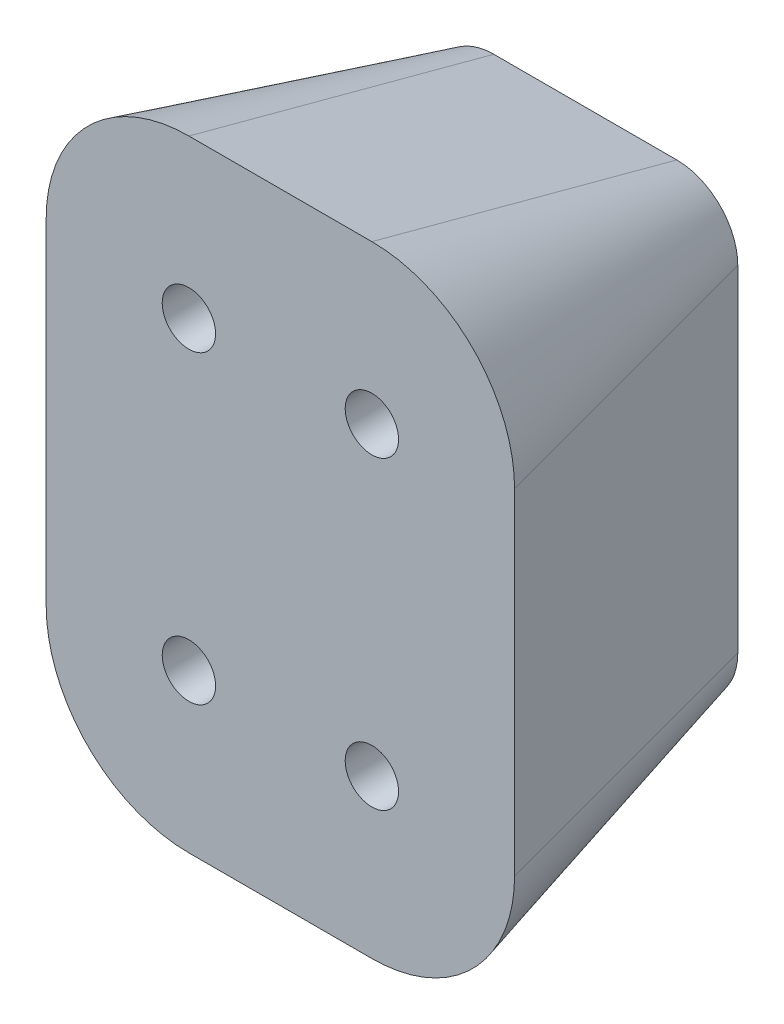
ISO-10303-21;
HEADER;
FILE_DESCRIPTION(('STEP AP214'),'2;1');
FILE_NAME('part.step','',(''),(''),'','','');
FILE_SCHEMA(('AUTOMOTIVE_DESIGN { 1 0 10303 214 1 1 1 1 }'));
ENDSEC;
DATA;
#1=APPLICATION_CONTEXT('core data for automotive mechanical design processes');
#2=APPLICATION_PROTOCOL_DEFINITION('international standard','automotive_design',2000,#1);
#3=PRODUCT_CONTEXT('',#1,'mechanical');
#4=PRODUCT('Part','Part','',(#3));
#5=PRODUCT_RELATED_PRODUCT_CATEGORY('part','',(#4));
#6=PRODUCT_DEFINITION_FORMATION('','',#4);
#7=PRODUCT_DEFINITION_CONTEXT('part definition',#1,'design');
#8=PRODUCT_DEFINITION('design','',#6,#7);
#9=PRODUCT_DEFINITION_SHAPE('','',#8);
#10=(LENGTH_UNIT() NAMED_UNIT(*) SI_UNIT(.MILLI.,.METRE.));
#11=(NAMED_UNIT(*) PLANE_ANGLE_UNIT() SI_UNIT($,.RADIAN.));
#12=(NAMED_UNIT(*) SI_UNIT($,.STERADIAN.) SOLID_ANGLE_UNIT());
#13=UNCERTAINTY_MEASURE_WITH_UNIT(LENGTH_MEASURE(1.E-05),#10,'distance_accuracy_value','');
#14=(GEOMETRIC_REPRESENTATION_CONTEXT(3) GLOBAL_UNCERTAINTY_ASSIGNED_CONTEXT((#13)) GLOBAL_UNIT_ASSIGNED_CONTEXT((#10,
#11,#12)) REPRESENTATION_CONTEXT('',''));
#15=CARTESIAN_POINT('',(0.,0.,0.));
#16=DIRECTION('',(0.,0.,1.));
#17=DIRECTION('',(1.,0.,0.));
#18=AXIS2_PLACEMENT_3D('',#15,#16,#17);
#19=CARTESIAN_POINT('',(-6.,10.,5.));
#20=DIRECTION('',(0.,0.,-1.));
#21=DIRECTION('',(-1.,0.,0.));
#22=AXIS2_PLACEMENT_3D('',#19,#20,#21);
#23=CYLINDRICAL_SURFACE('',#22,1.75);
#24=CARTESIAN_POINT('',(-6.,10.,25.));
#25=DIRECTION('',(0.,0.,1.));
#26=DIRECTION('',(1.,0.,0.));
#27=AXIS2_PLACEMENT_3D('',#24,#25,#26);
#28=CIRCLE('',#27,1.75);
#29=CARTESIAN_POINT('',(-4.25,10.,25.));
#30=VERTEX_POINT('',#29);
#31=EDGE_CURVE('E204',#30,#30,#28,.F.);
#32=ORIENTED_EDGE('',*,*,#31,.F.);
#33=EDGE_LOOP('',(#32));
#34=FACE_BOUND('',#33,.T.);
#35=CARTESIAN_POINT('',(-6.,10.,5.));
#36=DIRECTION('',(0.,0.,-1.));
#37=DIRECTION('',(-1.,0.,0.));
#38=AXIS2_PLACEMENT_3D('',#35,#36,#37);
#39=CIRCLE('',#38,1.75);
#40=CARTESIAN_POINT('',(-7.75,10.,5.));
#41=VERTEX_POINT('',#40);
#42=EDGE_CURVE('E207',#41,#41,#39,.T.);
#43=ORIENTED_EDGE('',*,*,#42,.T.);
#44=EDGE_LOOP('',(#43));
#45=FACE_BOUND('',#44,.T.);
#46=ADVANCED_FACE('F32',(#34,#45),#23,.F.);
#47=CARTESIAN_POINT('',(6.,10.,5.));
#48=DIRECTION('',(0.,0.,-1.));
#49=DIRECTION('',(-1.,0.,0.));
#50=AXIS2_PLACEMENT_3D('',#47,#48,#49);
#51=CYLINDRICAL_SURFACE('',#50,1.75);
#52=CARTESIAN_POINT('',(6.,10.,25.));
#53=DIRECTION('',(0.,0.,1.));
#54=DIRECTION('',(1.,0.,0.));
#55=AXIS2_PLACEMENT_3D('',#52,#53,#54);
#56=CIRCLE('',#55,1.75);
#57=CARTESIAN_POINT('',(7.75,10.,25.));
#58=VERTEX_POINT('',#57);
#59=EDGE_CURVE('E209',#58,#58,#56,.F.);
#60=ORIENTED_EDGE('',*,*,#59,.F.);
#61=EDGE_LOOP('',(#60));
#62=FACE_BOUND('',#61,.T.);
#63=CARTESIAN_POINT('',(6.,10.,5.));
#64=DIRECTION('',(0.,0.,-1.));
#65=DIRECTION('',(-1.,0.,0.));
#66=AXIS2_PLACEMENT_3D('',#63,#64,#65);
#67=CIRCLE('',#66,1.75);
#68=CARTESIAN_POINT('',(4.25,10.,5.));
#69=VERTEX_POINT('',#68);
#70=EDGE_CURVE('E210',#69,#69,#67,.T.);
#71=ORIENTED_EDGE('',*,*,#70,.T.);
#72=EDGE_LOOP('',(#71));
#73=FACE_BOUND('',#72,.T.);
#74=ADVANCED_FACE('F194',(#62,#73),#51,.F.);
#75=CARTESIAN_POINT('',(-6.,-10.,5.));
#76=DIRECTION('',(0.,0.,-1.));
#77=DIRECTION('',(-1.,0.,0.));
#78=AXIS2_PLACEMENT_3D('',#75,#76,#77);
#79=CYLINDRICAL_SURFACE('',#78,1.75);
#80=CARTESIAN_POINT('',(-6.,-10.,25.));
#81=DIRECTION('',(0.,0.,1.));
#82=DIRECTION('',(1.,0.,0.));
#83=AXIS2_PLACEMENT_3D('',#80,#81,#82);
#84=CIRCLE('',#83,1.75);
#85=CARTESIAN_POINT('',(-4.25,-10.,25.));
#86=VERTEX_POINT('',#85);
#87=EDGE_CURVE('E153',#86,#86,#84,.F.);
#88=ORIENTED_EDGE('',*,*,#87,.F.);
#89=EDGE_LOOP('',(#88));
#90=FACE_BOUND('',#89,.T.);
#91=CARTESIAN_POINT('',(-6.,-10.,5.));
#92=DIRECTION('',(0.,0.,-1.));
#93=DIRECTION('',(-1.,0.,0.));
#94=AXIS2_PLACEMENT_3D('',#91,#92,#93);
#95=CIRCLE('',#94,1.75);
#96=CARTESIAN_POINT('',(-7.75,-10.,5.));
#97=VERTEX_POINT('',#96);
#98=EDGE_CURVE('E214',#97,#97,#95,.T.);
#99=ORIENTED_EDGE('',*,*,#98,.T.);
#100=EDGE_LOOP('',(#99));
#101=FACE_BOUND('',#100,.T.);
#102=ADVANCED_FACE('F199',(#90,#101),#79,.F.);
#103=CARTESIAN_POINT('',(6.,-10.,5.));
#104=DIRECTION('',(0.,0.,-1.));
#105=DIRECTION('',(-1.,0.,0.));
#106=AXIS2_PLACEMENT_3D('',#103,#104,#105);
#107=CYLINDRICAL_SURFACE('',#106,1.75);
#108=CARTESIAN_POINT('',(6.,-10.,25.));
#109=DIRECTION('',(0.,0.,1.));
#110=DIRECTION('',(1.,0.,0.));
#111=AXIS2_PLACEMENT_3D('',#108,#109,#110);
#112=CIRCLE('',#111,1.75);
#113=CARTESIAN_POINT('',(7.75,-10.,25.));
#114=VERTEX_POINT('',#113);
#115=EDGE_CURVE('E148',#114,#114,#112,.F.);
#116=ORIENTED_EDGE('',*,*,#115,.F.);
#117=EDGE_LOOP('',(#116));
#118=FACE_BOUND('',#117,.T.);
#119=CARTESIAN_POINT('',(6.,-10.,5.));
#120=DIRECTION('',(0.,0.,-1.));
#121=DIRECTION('',(-1.,0.,0.));
#122=AXIS2_PLACEMENT_3D('',#119,#120,#121);
#123=CIRCLE('',#122,1.75);
#124=CARTESIAN_POINT('',(4.25,-10.,5.));
#125=VERTEX_POINT('',#124);
#126=EDGE_CURVE('E235',#125,#125,#123,.T.);
#127=ORIENTED_EDGE('',*,*,#126,.T.);
#128=EDGE_LOOP('',(#127));
#129=FACE_BOUND('',#128,.T.);
#130=ADVANCED_FACE('F229',(#118,#129),#107,.F.);
#131=CARTESIAN_POINT('',(-6.,-11.,5.));
#132=DIRECTION('',(0.,0.,1.));
#133=DIRECTION('',(1.,0.,0.));
#134=AXIS2_PLACEMENT_3D('',#131,#132,#133);
#135=CONICAL_SURFACE('',#134,4.,0.26179938779915);
#136=CARTESIAN_POINT('',(-6.,-11.,5.));
#137=DIRECTION('',(0.,0.,1.));
#138=DIRECTION('',(1.,0.,0.));
#139=AXIS2_PLACEMENT_3D('',#136,#137,#138);
#140=CIRCLE('',#139,4.);
#141=CARTESIAN_POINT('',(-10.,-11.,5.));
#142=VERTEX_POINT('',#141);
#143=CARTESIAN_POINT('',(-5.99999999999997,-15.,5.));
#144=VERTEX_POINT('',#143);
#145=EDGE_CURVE('E39',#142,#144,#140,.T.);
#146=ORIENTED_EDGE('',*,*,#145,.T.);
#147=DIRECTION('',(0.,-0.258819045102521,0.965925826289068));
#148=VECTOR('',#147,1.);
#149=CARTESIAN_POINT('',(-5.99999999999997,-15.,5.));
#150=LINE('',#149,#148);
#151=CARTESIAN_POINT('',(-5.99999999999997,-20.3589838486225,25.));
#152=VERTEX_POINT('',#151);
#153=EDGE_CURVE('E131',#152,#144,#150,.F.);
#154=ORIENTED_EDGE('',*,*,#153,.F.);
#155=CARTESIAN_POINT('',(-6.,-11.,25.));
#156=DIRECTION('',(0.,0.,1.));
#157=DIRECTION('',(1.,0.,0.));
#158=AXIS2_PLACEMENT_3D('',#155,#156,#157);
#159=CIRCLE('',#158,9.35898384862247);
#160=CARTESIAN_POINT('',(-15.3589838486225,-10.9999999999999,25.));
#161=VERTEX_POINT('',#160);
#162=EDGE_CURVE('E146',#161,#152,#159,.T.);
#163=ORIENTED_EDGE('',*,*,#162,.F.);
#164=DIRECTION('',(-0.258819045102521,0.,0.965925826289068));
#165=VECTOR('',#164,1.);
#166=CARTESIAN_POINT('',(-10.,-11.,5.));
#167=LINE('',#166,#165);
#168=EDGE_CURVE('E113',#161,#142,#167,.F.);
#169=ORIENTED_EDGE('',*,*,#168,.T.);
#170=EDGE_LOOP('',(#146,#154,#163,#169));
#171=FACE_BOUND('',#170,.T.);
#172=ADVANCED_FACE('F143',(#171),#135,.T.);
#173=CARTESIAN_POINT('',(-5.99999999999997,-15.,5.));
#174=DIRECTION('',(0.,-0.965925826289068,-0.258819045102521));
#175=DIRECTION('',(0.,0.258819045102521,-0.965925826289068));
#176=AXIS2_PLACEMENT_3D('',#173,#174,#175);
#177=PLANE('',#176);
#178=DIRECTION('',(1.,0.,0.));
#179=VECTOR('',#178,1.);
#180=CARTESIAN_POINT('',(-5.99999999999997,-15.,5.));
#181=LINE('',#180,#179);
#182=CARTESIAN_POINT('',(5.99999999999997,-15.,5.));
#183=VERTEX_POINT('',#182);
#184=EDGE_CURVE('E11',#144,#183,#181,.T.);
#185=ORIENTED_EDGE('',*,*,#184,.T.);
#186=DIRECTION('',(0.,-0.258819045102521,0.965925826289068));
#187=VECTOR('',#186,1.);
#188=CARTESIAN_POINT('',(5.99999999999997,-15.,5.));
#189=LINE('',#188,#187);
#190=CARTESIAN_POINT('',(5.99999999999993,-20.3589838486225,25.));
#191=VERTEX_POINT('',#190);
#192=EDGE_CURVE('E128',#191,#183,#189,.F.);
#193=ORIENTED_EDGE('',*,*,#192,.F.);
#194=DIRECTION('',(-1.,0.,0.));
#195=VECTOR('',#194,1.);
#196=CARTESIAN_POINT('',(-5.99999999999997,-20.3589838486225,25.));
#197=LINE('',#196,#195);
#198=EDGE_CURVE('E147',#152,#191,#197,.F.);
#199=ORIENTED_EDGE('',*,*,#198,.F.);
#200=ORIENTED_EDGE('',*,*,#153,.T.);
#201=EDGE_LOOP('',(#185,#193,#199,#200));
#202=FACE_BOUND('',#201,.T.);
#203=ADVANCED_FACE('F167',(#202),#177,.T.);
#204=CARTESIAN_POINT('',(6.,-11.,5.));
#205=DIRECTION('',(0.,0.,1.));
#206=DIRECTION('',(1.,0.,0.));
#207=AXIS2_PLACEMENT_3D('',#204,#205,#206);
#208=CONICAL_SURFACE('',#207,4.,0.26179938779915);
#209=CARTESIAN_POINT('',(6.,-11.,5.));
#210=DIRECTION('',(0.,0.,1.));
#211=DIRECTION('',(1.,0.,0.));
#212=AXIS2_PLACEMENT_3D('',#209,#210,#211);
#213=CIRCLE('',#212,4.);
#214=CARTESIAN_POINT('',(10.,-11.,5.));
#215=VERTEX_POINT('',#214);
#216=EDGE_CURVE('E132',#183,#215,#213,.T.);
#217=ORIENTED_EDGE('',*,*,#216,.T.);
#218=DIRECTION('',(0.258819045102521,0.,0.965925826289068));
#219=VECTOR('',#218,1.);
#220=CARTESIAN_POINT('',(10.,-11.,5.));
#221=LINE('',#220,#219);
#222=CARTESIAN_POINT('',(15.3589838486225,-11.,25.));
#223=VERTEX_POINT('',#222);
#224=EDGE_CURVE('E125',#223,#215,#221,.F.);
#225=ORIENTED_EDGE('',*,*,#224,.F.);
#226=CARTESIAN_POINT('',(6.,-11.,25.));
#227=DIRECTION('',(0.,0.,1.));
#228=DIRECTION('',(1.,0.,0.));
#229=AXIS2_PLACEMENT_3D('',#226,#227,#228);
#230=CIRCLE('',#229,9.35898384862247);
#231=EDGE_CURVE('E150',#191,#223,#230,.T.);
#232=ORIENTED_EDGE('',*,*,#231,.F.);
#233=ORIENTED_EDGE('',*,*,#192,.T.);
#234=EDGE_LOOP('',(#217,#225,#232,#233));
#235=FACE_BOUND('',#234,.T.);
#236=ADVANCED_FACE('F175',(#235),#208,.T.);
#237=CARTESIAN_POINT('',(10.,-11.,5.));
#238=DIRECTION('',(0.965925826289068,0.,-0.258819045102521));
#239=DIRECTION('',(-0.258819045102521,0.,-0.965925826289068));
#240=AXIS2_PLACEMENT_3D('',#237,#238,#239);
#241=PLANE('',#240);
#242=DIRECTION('',(0.,1.,0.));
#243=VECTOR('',#242,1.);
#244=CARTESIAN_POINT('',(10.,11.,5.));
#245=LINE('',#244,#243);
#246=CARTESIAN_POINT('',(10.,11.,5.));
#247=VERTEX_POINT('',#246);
#248=EDGE_CURVE('E135',#215,#247,#245,.T.);
#249=ORIENTED_EDGE('',*,*,#248,.T.);
#250=DIRECTION('',(0.258819045102521,0.,0.965925826289068));
#251=VECTOR('',#250,1.);
#252=CARTESIAN_POINT('',(10.,11.,5.));
#253=LINE('',#252,#251);
#254=CARTESIAN_POINT('',(15.3589838486225,10.9999999999999,25.));
#255=VERTEX_POINT('',#254);
#256=EDGE_CURVE('E122',#255,#247,#253,.F.);
#257=ORIENTED_EDGE('',*,*,#256,.F.);
#258=DIRECTION('',(0.,-1.,0.));
#259=VECTOR('',#258,1.);
#260=CARTESIAN_POINT('',(15.3589838486225,-11.,25.));
#261=LINE('',#260,#259);
#262=EDGE_CURVE('E158',#223,#255,#261,.F.);
#263=ORIENTED_EDGE('',*,*,#262,.F.);
#264=ORIENTED_EDGE('',*,*,#224,.T.);
#265=EDGE_LOOP('',(#249,#257,#263,#264));
#266=FACE_BOUND('',#265,.T.);
#267=ADVANCED_FACE('F177',(#266),#241,.T.);
#268=CARTESIAN_POINT('',(6.,11.,5.));
#269=DIRECTION('',(0.,0.,1.));
#270=DIRECTION('',(1.,0.,0.));
#271=AXIS2_PLACEMENT_3D('',#268,#269,#270);
#272=CONICAL_SURFACE('',#271,4.,0.26179938779915);
#273=CARTESIAN_POINT('',(6.,11.,5.));
#274=DIRECTION('',(0.,0.,1.));
#275=DIRECTION('',(-1.,0.,0.));
#276=AXIS2_PLACEMENT_3D('',#273,#274,#275);
#277=CIRCLE('',#276,4.);
#278=CARTESIAN_POINT('',(5.99999999999997,15.,5.));
#279=VERTEX_POINT('',#278);
#280=EDGE_CURVE('E138',#247,#279,#277,.T.);
#281=ORIENTED_EDGE('',*,*,#280,.T.);
#282=DIRECTION('',(0.,0.258819045102521,0.965925826289068));
#283=VECTOR('',#282,1.);
#284=CARTESIAN_POINT('',(5.99999999999997,15.,5.));
#285=LINE('',#284,#283);
#286=CARTESIAN_POINT('',(5.99999999999997,20.3589838486225,25.));
#287=VERTEX_POINT('',#286);
#288=EDGE_CURVE('E115',#287,#279,#285,.F.);
#289=ORIENTED_EDGE('',*,*,#288,.F.);
#290=CARTESIAN_POINT('',(6.,11.,25.));
#291=DIRECTION('',(0.,0.,1.));
#292=DIRECTION('',(1.,0.,0.));
#293=AXIS2_PLACEMENT_3D('',#290,#291,#292);
#294=CIRCLE('',#293,9.35898384862247);
#295=EDGE_CURVE('E160',#255,#287,#294,.T.);
#296=ORIENTED_EDGE('',*,*,#295,.F.);
#297=ORIENTED_EDGE('',*,*,#256,.T.);
#298=EDGE_LOOP('',(#281,#289,#296,#297));
#299=FACE_BOUND('',#298,.T.);
#300=ADVANCED_FACE('F181',(#299),#272,.T.);
#301=CARTESIAN_POINT('',(5.99999999999997,15.,5.));
#302=DIRECTION('',(0.,0.965925826289068,-0.258819045102521));
#303=DIRECTION('',(0.,0.258819045102521,0.965925826289068));
#304=AXIS2_PLACEMENT_3D('',#301,#302,#303);
#305=PLANE('',#304);
#306=DIRECTION('',(-1.,0.,0.));
#307=VECTOR('',#306,1.);
#308=CARTESIAN_POINT('',(-5.99999999999997,15.,5.));
#309=LINE('',#308,#307);
#310=CARTESIAN_POINT('',(-5.99999999999997,15.,5.));
#311=VERTEX_POINT('',#310);
#312=EDGE_CURVE('E110',#279,#311,#309,.T.);
#313=ORIENTED_EDGE('',*,*,#312,.T.);
#314=DIRECTION('',(0.,0.258819045102521,0.965925826289068));
#315=VECTOR('',#314,1.);
#316=CARTESIAN_POINT('',(-5.99999999999997,15.,5.));
#317=LINE('',#316,#315);
#318=CARTESIAN_POINT('',(-5.99999999999994,20.3589838486225,25.));
#319=VERTEX_POINT('',#318);
#320=EDGE_CURVE('E109',#319,#311,#317,.F.);
#321=ORIENTED_EDGE('',*,*,#320,.F.);
#322=DIRECTION('',(1.,0.,0.));
#323=VECTOR('',#322,1.);
#324=CARTESIAN_POINT('',(5.99999999999997,20.3589838486225,25.));
#325=LINE('',#324,#323);
#326=EDGE_CURVE('E162',#287,#319,#325,.F.);
#327=ORIENTED_EDGE('',*,*,#326,.F.);
#328=ORIENTED_EDGE('',*,*,#288,.T.);
#329=EDGE_LOOP('',(#313,#321,#327,#328));
#330=FACE_BOUND('',#329,.T.);
#331=ADVANCED_FACE('F184',(#330),#305,.T.);
#332=CARTESIAN_POINT('',(-6.,11.,5.));
#333=DIRECTION('',(0.,0.,1.));
#334=DIRECTION('',(1.,0.,0.));
#335=AXIS2_PLACEMENT_3D('',#332,#333,#334);
#336=CONICAL_SURFACE('',#335,4.,0.26179938779915);
#337=CARTESIAN_POINT('',(-6.,11.,5.));
#338=DIRECTION('',(0.,0.,1.));
#339=DIRECTION('',(-1.,0.,0.));
#340=AXIS2_PLACEMENT_3D('',#337,#338,#339);
#341=CIRCLE('',#340,4.);
#342=CARTESIAN_POINT('',(-10.,11.,5.));
#343=VERTEX_POINT('',#342);
#344=EDGE_CURVE('E96',#311,#343,#341,.T.);
#345=ORIENTED_EDGE('',*,*,#344,.T.);
#346=DIRECTION('',(-0.258819045102521,0.,0.965925826289068));
#347=VECTOR('',#346,1.);
#348=CARTESIAN_POINT('',(-10.,11.,5.));
#349=LINE('',#348,#347);
#350=CARTESIAN_POINT('',(-15.3589838486225,11.,25.));
#351=VERTEX_POINT('',#350);
#352=EDGE_CURVE('E107',#351,#343,#349,.F.);
#353=ORIENTED_EDGE('',*,*,#352,.F.);
#354=CARTESIAN_POINT('',(-6.,11.,25.));
#355=DIRECTION('',(0.,0.,1.));
#356=DIRECTION('',(1.,0.,0.));
#357=AXIS2_PLACEMENT_3D('',#354,#355,#356);
#358=CIRCLE('',#357,9.35898384862247);
#359=EDGE_CURVE('E164',#319,#351,#358,.T.);
#360=ORIENTED_EDGE('',*,*,#359,.F.);
#361=ORIENTED_EDGE('',*,*,#320,.T.);
#362=EDGE_LOOP('',(#345,#353,#360,#361));
#363=FACE_BOUND('',#362,.T.);
#364=ADVANCED_FACE('F105',(#363),#336,.T.);
#365=CARTESIAN_POINT('',(-10.,11.,5.));
#366=DIRECTION('',(-0.965925826289068,0.,-0.258819045102521));
#367=DIRECTION('',(-0.258819045102521,0.,0.965925826289068));
#368=AXIS2_PLACEMENT_3D('',#365,#366,#367);
#369=PLANE('',#368);
#370=DIRECTION('',(0.,-1.,0.));
#371=VECTOR('',#370,1.);
#372=CARTESIAN_POINT('',(-10.,11.,5.));
#373=LINE('',#372,#371);
#374=EDGE_CURVE('E93',#343,#142,#373,.T.);
#375=ORIENTED_EDGE('',*,*,#374,.T.);
#376=ORIENTED_EDGE('',*,*,#168,.F.);
#377=DIRECTION('',(0.,1.,0.));
#378=VECTOR('',#377,1.);
#379=CARTESIAN_POINT('',(-15.3589838486225,11.,25.));
#380=LINE('',#379,#378);
#381=EDGE_CURVE('E53',#351,#161,#380,.F.);
#382=ORIENTED_EDGE('',*,*,#381,.F.);
#383=ORIENTED_EDGE('',*,*,#352,.T.);
#384=EDGE_LOOP('',(#375,#376,#382,#383));
#385=FACE_BOUND('',#384,.T.);
#386=ADVANCED_FACE('F112',(#385),#369,.T.);
#387=CARTESIAN_POINT('',(-6.,-11.,25.));
#388=DIRECTION('',(0.,0.,1.));
#389=DIRECTION('',(1.,0.,0.));
#390=AXIS2_PLACEMENT_3D('',#387,#388,#389);
#391=PLANE('',#390);
#392=ORIENTED_EDGE('',*,*,#87,.T.);
#393=EDGE_LOOP('',(#392));
#394=FACE_BOUND('',#393,.T.);
#395=ORIENTED_EDGE('',*,*,#31,.T.);
#396=EDGE_LOOP('',(#395));
#397=FACE_BOUND('',#396,.T.);
#398=ORIENTED_EDGE('',*,*,#59,.T.);
#399=EDGE_LOOP('',(#398));
#400=FACE_BOUND('',#399,.T.);
#401=ORIENTED_EDGE('',*,*,#115,.T.);
#402=EDGE_LOOP('',(#401));
#403=FACE_BOUND('',#402,.T.);
#404=ORIENTED_EDGE('',*,*,#162,.T.);
#405=ORIENTED_EDGE('',*,*,#198,.T.);
#406=ORIENTED_EDGE('',*,*,#231,.T.);
#407=ORIENTED_EDGE('',*,*,#262,.T.);
#408=ORIENTED_EDGE('',*,*,#295,.T.);
#409=ORIENTED_EDGE('',*,*,#326,.T.);
#410=ORIENTED_EDGE('',*,*,#359,.T.);
#411=ORIENTED_EDGE('',*,*,#381,.T.);
#412=EDGE_LOOP('',(#404,#405,#406,#407,#408,#409,#410,#411));
#413=FACE_BOUND('',#412,.T.);
#414=ADVANCED_FACE('F170',(#394,#397,#400,#403,#413),#391,.T.);
#415=CARTESIAN_POINT('',(-6.,-11.,5.));
#416=DIRECTION('',(0.,0.,-1.));
#417=DIRECTION('',(-1.,0.,0.));
#418=AXIS2_PLACEMENT_3D('',#415,#416,#417);
#419=PLANE('',#418);
#420=ORIENTED_EDGE('',*,*,#42,.F.);
#421=EDGE_LOOP('',(#420));
#422=FACE_BOUND('',#421,.T.);
#423=ORIENTED_EDGE('',*,*,#70,.F.);
#424=EDGE_LOOP('',(#423));
#425=FACE_BOUND('',#424,.T.);
#426=ORIENTED_EDGE('',*,*,#98,.F.);
#427=EDGE_LOOP('',(#426));
#428=FACE_BOUND('',#427,.T.);
#429=ORIENTED_EDGE('',*,*,#126,.F.);
#430=EDGE_LOOP('',(#429));
#431=FACE_BOUND('',#430,.T.);
#432=ORIENTED_EDGE('',*,*,#145,.F.);
#433=ORIENTED_EDGE('',*,*,#374,.F.);
#434=ORIENTED_EDGE('',*,*,#344,.F.);
#435=ORIENTED_EDGE('',*,*,#312,.F.);
#436=ORIENTED_EDGE('',*,*,#280,.F.);
#437=ORIENTED_EDGE('',*,*,#248,.F.);
#438=ORIENTED_EDGE('',*,*,#216,.F.);
#439=ORIENTED_EDGE('',*,*,#184,.F.);
#440=EDGE_LOOP('',(#432,#433,#434,#435,#436,#437,#438,#439));
#441=FACE_BOUND('',#440,.T.);
#442=ADVANCED_FACE('F95',(#422,#425,#428,#431,#441),#419,.T.);
#443=CLOSED_SHELL('',(#46,#74,#102,#130,#172,#203,#236,#267,#300,#331,#364,#386,#414,#442));
#444=MANIFOLD_SOLID_BREP('B2',#443);
#445=ADVANCED_BREP_SHAPE_REPRESENTATION('',(#18,#444),#14);
#446=SHAPE_DEFINITION_REPRESENTATION(#9,#445);
ENDSEC;
END-ISO-10303-21;
